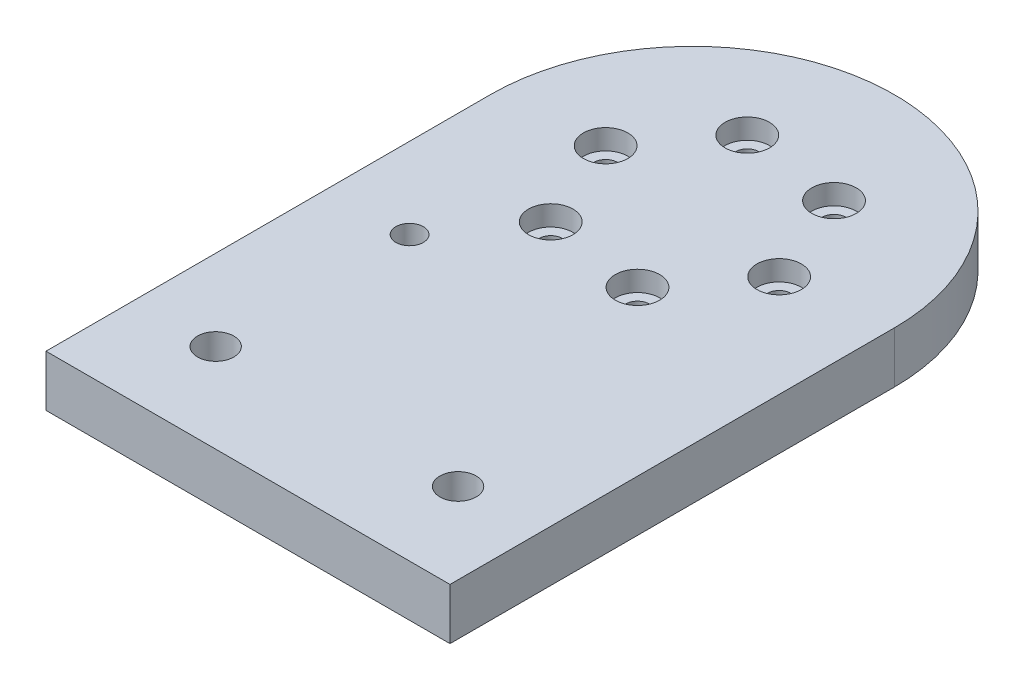
ISO-10303-21;
HEADER;
FILE_DESCRIPTION(('STEP AP214'),'2;1');
FILE_NAME('part.step','',(''),(''),'','','');
FILE_SCHEMA(('AUTOMOTIVE_DESIGN { 1 0 10303 214 1 1 1 1 }'));
ENDSEC;
DATA;
#1=APPLICATION_CONTEXT('core data for automotive mechanical design processes');
#2=APPLICATION_PROTOCOL_DEFINITION('international standard','automotive_design',2000,#1);
#3=PRODUCT_CONTEXT('',#1,'mechanical');
#4=PRODUCT('Part','Part','',(#3));
#5=PRODUCT_RELATED_PRODUCT_CATEGORY('part','',(#4));
#6=PRODUCT_DEFINITION_FORMATION('','',#4);
#7=PRODUCT_DEFINITION_CONTEXT('part definition',#1,'design');
#8=PRODUCT_DEFINITION('design','',#6,#7);
#9=PRODUCT_DEFINITION_SHAPE('','',#8);
#10=(LENGTH_UNIT() NAMED_UNIT(*) SI_UNIT(.MILLI.,.METRE.));
#11=(NAMED_UNIT(*) PLANE_ANGLE_UNIT() SI_UNIT($,.RADIAN.));
#12=(NAMED_UNIT(*) SI_UNIT($,.STERADIAN.) SOLID_ANGLE_UNIT());
#13=UNCERTAINTY_MEASURE_WITH_UNIT(LENGTH_MEASURE(1.E-05),#10,'distance_accuracy_value','');
#14=(GEOMETRIC_REPRESENTATION_CONTEXT(3) GLOBAL_UNCERTAINTY_ASSIGNED_CONTEXT((#13)) GLOBAL_UNIT_ASSIGNED_CONTEXT((#10,
#11,#12)) REPRESENTATION_CONTEXT('',''));
#15=CARTESIAN_POINT('',(0.,0.,0.));
#16=DIRECTION('',(0.,0.,1.));
#17=DIRECTION('',(1.,0.,0.));
#18=AXIS2_PLACEMENT_3D('',#15,#16,#17);
#19=CARTESIAN_POINT('',(4.76337970437843,40.85,501.556825420154));
#20=DIRECTION('',(0.,-1.,0.));
#21=DIRECTION('',(0.,0.,-1.));
#22=AXIS2_PLACEMENT_3D('',#19,#20,#21);
#23=CYLINDRICAL_SURFACE('',#22,1.45);
#24=CARTESIAN_POINT('',(4.76337970437843,34.5,501.556825420154));
#25=DIRECTION('',(0.,1.,0.));
#26=DIRECTION('',(0.,0.,1.));
#27=AXIS2_PLACEMENT_3D('',#24,#25,#26);
#28=CIRCLE('',#27,1.45);
#29=CARTESIAN_POINT('',(4.76337970437843,34.5,503.006825420154));
#30=VERTEX_POINT('',#29);
#31=EDGE_CURVE('E152',#30,#30,#28,.T.);
#32=ORIENTED_EDGE('',*,*,#31,.F.);
#33=EDGE_LOOP('',(#32));
#34=FACE_BOUND('',#33,.T.);
#35=CARTESIAN_POINT('',(4.76337970437843,38.35,501.556825420154));
#36=DIRECTION('',(0.,1.,0.));
#37=DIRECTION('',(0.,0.,1.));
#38=AXIS2_PLACEMENT_3D('',#35,#36,#37);
#39=CIRCLE('',#38,1.45);
#40=CARTESIAN_POINT('',(4.76337970437843,38.35,503.006825420154));
#41=VERTEX_POINT('',#40);
#42=EDGE_CURVE('E43',#41,#41,#39,.T.);
#43=ORIENTED_EDGE('',*,*,#42,.T.);
#44=EDGE_LOOP('',(#43));
#45=FACE_BOUND('',#44,.T.);
#46=ADVANCED_FACE('F39',(#34,#45),#23,.F.);
#47=CARTESIAN_POINT('',(-7.62681454876585,40.85,499.90362054194));
#48=DIRECTION('',(0.,-1.,0.));
#49=DIRECTION('',(0.,0.,-1.));
#50=AXIS2_PLACEMENT_3D('',#47,#48,#49);
#51=CYLINDRICAL_SURFACE('',#50,1.45);
#52=CARTESIAN_POINT('',(-7.62681454876585,34.5,499.90362054194));
#53=DIRECTION('',(0.,1.,0.));
#54=DIRECTION('',(0.,0.,1.));
#55=AXIS2_PLACEMENT_3D('',#52,#53,#54);
#56=CIRCLE('',#55,1.45);
#57=CARTESIAN_POINT('',(-7.62681454876585,34.5,501.35362054194));
#58=VERTEX_POINT('',#57);
#59=EDGE_CURVE('E160',#58,#58,#56,.T.);
#60=ORIENTED_EDGE('',*,*,#59,.F.);
#61=EDGE_LOOP('',(#60));
#62=FACE_BOUND('',#61,.T.);
#63=CARTESIAN_POINT('',(-7.62681454876585,38.35,499.90362054194));
#64=DIRECTION('',(0.,1.,0.));
#65=DIRECTION('',(0.,0.,1.));
#66=AXIS2_PLACEMENT_3D('',#63,#64,#65);
#67=CIRCLE('',#66,1.45);
#68=CARTESIAN_POINT('',(-7.62681454876585,38.35,501.35362054194));
#69=VERTEX_POINT('',#68);
#70=EDGE_CURVE('E183',#69,#69,#67,.T.);
#71=ORIENTED_EDGE('',*,*,#70,.T.);
#72=EDGE_LOOP('',(#71));
#73=FACE_BOUND('',#72,.T.);
#74=ADVANCED_FACE('F211',(#62,#73),#51,.F.);
#75=CARTESIAN_POINT('',(-12.3901942531443,40.85,488.346795121786));
#76=DIRECTION('',(0.,-1.,0.));
#77=DIRECTION('',(0.,0.,-1.));
#78=AXIS2_PLACEMENT_3D('',#75,#76,#77);
#79=CYLINDRICAL_SURFACE('',#78,1.45);
#80=CARTESIAN_POINT('',(-12.3901942531443,34.5,488.346795121786));
#81=DIRECTION('',(0.,1.,0.));
#82=DIRECTION('',(0.,0.,1.));
#83=AXIS2_PLACEMENT_3D('',#80,#81,#82);
#84=CIRCLE('',#83,1.45);
#85=CARTESIAN_POINT('',(-12.3901942531443,34.5,489.796795121786));
#86=VERTEX_POINT('',#85);
#87=EDGE_CURVE('E163',#86,#86,#84,.T.);
#88=ORIENTED_EDGE('',*,*,#87,.F.);
#89=EDGE_LOOP('',(#88));
#90=FACE_BOUND('',#89,.T.);
#91=CARTESIAN_POINT('',(-12.3901942531443,38.35,488.346795121786));
#92=DIRECTION('',(0.,1.,0.));
#93=DIRECTION('',(0.,0.,1.));
#94=AXIS2_PLACEMENT_3D('',#91,#92,#93);
#95=CIRCLE('',#94,1.45);
#96=CARTESIAN_POINT('',(-12.3901942531443,38.35,489.796795121786));
#97=VERTEX_POINT('',#96);
#98=EDGE_CURVE('E185',#97,#97,#95,.T.);
#99=ORIENTED_EDGE('',*,*,#98,.T.);
#100=EDGE_LOOP('',(#99));
#101=FACE_BOUND('',#100,.T.);
#102=ADVANCED_FACE('F220',(#90,#101),#79,.F.);
#103=CARTESIAN_POINT('',(-4.76337970437842,40.85,478.443174579846));
#104=DIRECTION('',(0.,-1.,0.));
#105=DIRECTION('',(0.,0.,-1.));
#106=AXIS2_PLACEMENT_3D('',#103,#104,#105);
#107=CYLINDRICAL_SURFACE('',#106,1.45);
#108=CARTESIAN_POINT('',(-4.76337970437842,34.5,478.443174579846));
#109=DIRECTION('',(0.,1.,0.));
#110=DIRECTION('',(0.,0.,1.));
#111=AXIS2_PLACEMENT_3D('',#108,#109,#110);
#112=CIRCLE('',#111,1.45);
#113=CARTESIAN_POINT('',(-4.76337970437842,34.5,479.893174579846));
#114=VERTEX_POINT('',#113);
#115=EDGE_CURVE('E153',#114,#114,#112,.T.);
#116=ORIENTED_EDGE('',*,*,#115,.F.);
#117=EDGE_LOOP('',(#116));
#118=FACE_BOUND('',#117,.T.);
#119=CARTESIAN_POINT('',(-4.76337970437842,38.35,478.443174579846));
#120=DIRECTION('',(0.,1.,0.));
#121=DIRECTION('',(0.,0.,1.));
#122=AXIS2_PLACEMENT_3D('',#119,#120,#121);
#123=CIRCLE('',#122,1.45);
#124=CARTESIAN_POINT('',(-4.76337970437842,38.35,479.893174579846));
#125=VERTEX_POINT('',#124);
#126=EDGE_CURVE('E177',#125,#125,#123,.T.);
#127=ORIENTED_EDGE('',*,*,#126,.T.);
#128=EDGE_LOOP('',(#127));
#129=FACE_BOUND('',#128,.T.);
#130=ADVANCED_FACE('F226',(#118,#129),#107,.F.);
#131=CARTESIAN_POINT('',(7.62681454876585,40.85,480.09637945806));
#132=DIRECTION('',(0.,-1.,0.));
#133=DIRECTION('',(0.,0.,-1.));
#134=AXIS2_PLACEMENT_3D('',#131,#132,#133);
#135=CYLINDRICAL_SURFACE('',#134,1.45);
#136=CARTESIAN_POINT('',(7.62681454876585,34.5,480.09637945806));
#137=DIRECTION('',(0.,1.,0.));
#138=DIRECTION('',(0.,0.,1.));
#139=AXIS2_PLACEMENT_3D('',#136,#137,#138);
#140=CIRCLE('',#139,1.45);
#141=CARTESIAN_POINT('',(7.62681454876585,34.5,481.54637945806));
#142=VERTEX_POINT('',#141);
#143=EDGE_CURVE('E154',#142,#142,#140,.T.);
#144=ORIENTED_EDGE('',*,*,#143,.F.);
#145=EDGE_LOOP('',(#144));
#146=FACE_BOUND('',#145,.T.);
#147=CARTESIAN_POINT('',(7.62681454876585,38.35,480.09637945806));
#148=DIRECTION('',(0.,1.,0.));
#149=DIRECTION('',(0.,0.,1.));
#150=AXIS2_PLACEMENT_3D('',#147,#148,#149);
#151=CIRCLE('',#150,1.45);
#152=CARTESIAN_POINT('',(7.62681454876585,38.35,481.54637945806));
#153=VERTEX_POINT('',#152);
#154=EDGE_CURVE('E176',#153,#153,#151,.T.);
#155=ORIENTED_EDGE('',*,*,#154,.T.);
#156=EDGE_LOOP('',(#155));
#157=FACE_BOUND('',#156,.T.);
#158=ADVANCED_FACE('F225',(#146,#157),#135,.F.);
#159=CARTESIAN_POINT('',(12.3901942531443,40.85,491.653204878214));
#160=DIRECTION('',(0.,-1.,0.));
#161=DIRECTION('',(0.,0.,-1.));
#162=AXIS2_PLACEMENT_3D('',#159,#160,#161);
#163=CYLINDRICAL_SURFACE('',#162,1.45);
#164=CARTESIAN_POINT('',(12.3901942531443,34.5,491.653204878214));
#165=DIRECTION('',(0.,1.,0.));
#166=DIRECTION('',(0.,0.,1.));
#167=AXIS2_PLACEMENT_3D('',#164,#165,#166);
#168=CIRCLE('',#167,1.45);
#169=CARTESIAN_POINT('',(12.3901942531443,34.5,493.103204878214));
#170=VERTEX_POINT('',#169);
#171=EDGE_CURVE('E149',#170,#170,#168,.T.);
#172=ORIENTED_EDGE('',*,*,#171,.F.);
#173=EDGE_LOOP('',(#172));
#174=FACE_BOUND('',#173,.T.);
#175=CARTESIAN_POINT('',(12.3901942531443,38.35,491.653204878214));
#176=DIRECTION('',(0.,1.,0.));
#177=DIRECTION('',(0.,0.,1.));
#178=AXIS2_PLACEMENT_3D('',#175,#176,#177);
#179=CIRCLE('',#178,1.45);
#180=CARTESIAN_POINT('',(12.3901942531443,38.35,493.103204878214));
#181=VERTEX_POINT('',#180);
#182=EDGE_CURVE('E143',#181,#181,#179,.T.);
#183=ORIENTED_EDGE('',*,*,#182,.T.);
#184=EDGE_LOOP('',(#183));
#185=FACE_BOUND('',#184,.T.);
#186=ADVANCED_FACE('F250',(#174,#185),#163,.F.);
#187=CARTESIAN_POINT('',(25.,40.85,526.));
#188=DIRECTION('',(-1.,0.,0.));
#189=DIRECTION('',(0.,0.,1.));
#190=AXIS2_PLACEMENT_3D('',#187,#188,#189);
#191=PLANE('',#190);
#192=DIRECTION('',(0.,0.,-1.));
#193=VECTOR('',#192,1.);
#194=CARTESIAN_POINT('',(25.,34.5,526.));
#195=LINE('',#194,#193);
#196=CARTESIAN_POINT('',(25.,34.5,545.));
#197=VERTEX_POINT('',#196);
#198=CARTESIAN_POINT('',(25.,34.5,490.));
#199=VERTEX_POINT('',#198);
#200=EDGE_CURVE('E170',#197,#199,#195,.T.);
#201=ORIENTED_EDGE('',*,*,#200,.T.);
#202=DIRECTION('',(0.,-1.,0.));
#203=VECTOR('',#202,1.);
#204=CARTESIAN_POINT('',(25.,40.85,490.));
#205=LINE('',#204,#203);
#206=CARTESIAN_POINT('',(25.,40.85,490.));
#207=VERTEX_POINT('',#206);
#208=EDGE_CURVE('E11',#207,#199,#205,.T.);
#209=ORIENTED_EDGE('',*,*,#208,.F.);
#210=DIRECTION('',(0.,0.,-1.));
#211=VECTOR('',#210,1.);
#212=CARTESIAN_POINT('',(25.,40.85,526.));
#213=LINE('',#212,#211);
#214=CARTESIAN_POINT('',(25.,40.85,545.));
#215=VERTEX_POINT('',#214);
#216=EDGE_CURVE('E90',#215,#207,#213,.T.);
#217=ORIENTED_EDGE('',*,*,#216,.F.);
#218=DIRECTION('',(0.,-1.,0.));
#219=VECTOR('',#218,1.);
#220=CARTESIAN_POINT('',(25.,40.85,545.));
#221=LINE('',#220,#219);
#222=EDGE_CURVE('E100',#215,#197,#221,.T.);
#223=ORIENTED_EDGE('',*,*,#222,.T.);
#224=EDGE_LOOP('',(#201,#209,#217,#223));
#225=FACE_BOUND('',#224,.T.);
#226=ADVANCED_FACE('F41',(#225),#191,.F.);
#227=CARTESIAN_POINT('',(-25.,40.85,526.));
#228=DIRECTION('',(1.,0.,0.));
#229=DIRECTION('',(0.,0.,-1.));
#230=AXIS2_PLACEMENT_3D('',#227,#228,#229);
#231=PLANE('',#230);
#232=DIRECTION('',(0.,0.,1.));
#233=VECTOR('',#232,1.);
#234=CARTESIAN_POINT('',(-25.,34.5,526.));
#235=LINE('',#234,#233);
#236=CARTESIAN_POINT('',(-25.,34.5,490.));
#237=VERTEX_POINT('',#236);
#238=CARTESIAN_POINT('',(-25.,34.5,545.));
#239=VERTEX_POINT('',#238);
#240=EDGE_CURVE('E93',#237,#239,#235,.T.);
#241=ORIENTED_EDGE('',*,*,#240,.T.);
#242=DIRECTION('',(0.,-1.,0.));
#243=VECTOR('',#242,1.);
#244=CARTESIAN_POINT('',(-25.,40.85,545.));
#245=LINE('',#244,#243);
#246=CARTESIAN_POINT('',(-25.,40.85,545.));
#247=VERTEX_POINT('',#246);
#248=EDGE_CURVE('E94',#247,#239,#245,.T.);
#249=ORIENTED_EDGE('',*,*,#248,.F.);
#250=DIRECTION('',(0.,0.,1.));
#251=VECTOR('',#250,1.);
#252=CARTESIAN_POINT('',(-25.,40.85,526.));
#253=LINE('',#252,#251);
#254=CARTESIAN_POINT('',(-25.,40.85,490.));
#255=VERTEX_POINT('',#254);
#256=EDGE_CURVE('E79',#255,#247,#253,.T.);
#257=ORIENTED_EDGE('',*,*,#256,.F.);
#258=DIRECTION('',(0.,-1.,0.));
#259=VECTOR('',#258,1.);
#260=CARTESIAN_POINT('',(-25.,40.85,490.));
#261=LINE('',#260,#259);
#262=EDGE_CURVE('E48',#255,#237,#261,.T.);
#263=ORIENTED_EDGE('',*,*,#262,.T.);
#264=EDGE_LOOP('',(#241,#249,#257,#263));
#265=FACE_BOUND('',#264,.T.);
#266=ADVANCED_FACE('F91',(#265),#231,.F.);
#267=CARTESIAN_POINT('',(0.,40.85,0.));
#268=DIRECTION('',(0.,-1.,0.));
#269=DIRECTION('',(0.,0.,-1.));
#270=AXIS2_PLACEMENT_3D('',#267,#268,#269);
#271=PLANE('',#270);
#272=CARTESIAN_POINT('',(-15.,40.85,510.));
#273=DIRECTION('',(0.,1.,0.));
#274=DIRECTION('',(0.,0.,1.));
#275=AXIS2_PLACEMENT_3D('',#272,#273,#274);
#276=CIRCLE('',#275,1.7);
#277=CARTESIAN_POINT('',(-15.,40.85,511.7));
#278=VERTEX_POINT('',#277);
#279=EDGE_CURVE('E332',#278,#278,#276,.T.);
#280=ORIENTED_EDGE('',*,*,#279,.F.);
#281=EDGE_LOOP('',(#280));
#282=FACE_BOUND('',#281,.T.);
#283=CARTESIAN_POINT('',(-15.,40.85,534.));
#284=DIRECTION('',(0.,1.,0.));
#285=DIRECTION('',(0.,0.,1.));
#286=AXIS2_PLACEMENT_3D('',#283,#284,#285);
#287=CIRCLE('',#286,2.25);
#288=CARTESIAN_POINT('',(-15.,40.85,536.25));
#289=VERTEX_POINT('',#288);
#290=EDGE_CURVE('E106',#289,#289,#287,.T.);
#291=ORIENTED_EDGE('',*,*,#290,.F.);
#292=EDGE_LOOP('',(#291));
#293=FACE_BOUND('',#292,.T.);
#294=CARTESIAN_POINT('',(15.,40.85,534.));
#295=DIRECTION('',(0.,1.,0.));
#296=DIRECTION('',(0.,0.,1.));
#297=AXIS2_PLACEMENT_3D('',#294,#295,#296);
#298=CIRCLE('',#297,2.25);
#299=CARTESIAN_POINT('',(15.,40.85,536.25));
#300=VERTEX_POINT('',#299);
#301=EDGE_CURVE('E107',#300,#300,#298,.T.);
#302=ORIENTED_EDGE('',*,*,#301,.F.);
#303=EDGE_LOOP('',(#302));
#304=FACE_BOUND('',#303,.T.);
#305=CARTESIAN_POINT('',(4.76337970437843,40.85,501.556825420154));
#306=DIRECTION('',(0.,1.,0.));
#307=DIRECTION('',(0.,0.,1.));
#308=AXIS2_PLACEMENT_3D('',#305,#306,#307);
#309=CIRCLE('',#308,2.75);
#310=CARTESIAN_POINT('',(4.76337970437843,40.85,504.306825420154));
#311=VERTEX_POINT('',#310);
#312=EDGE_CURVE('E125',#311,#311,#309,.T.);
#313=ORIENTED_EDGE('',*,*,#312,.F.);
#314=EDGE_LOOP('',(#313));
#315=FACE_BOUND('',#314,.T.);
#316=CARTESIAN_POINT('',(-7.62681454876585,40.85,499.90362054194));
#317=DIRECTION('',(0.,1.,0.));
#318=DIRECTION('',(0.,0.,1.));
#319=AXIS2_PLACEMENT_3D('',#316,#317,#318);
#320=CIRCLE('',#319,2.75);
#321=CARTESIAN_POINT('',(-7.62681454876585,40.85,502.65362054194));
#322=VERTEX_POINT('',#321);
#323=EDGE_CURVE('E129',#322,#322,#320,.T.);
#324=ORIENTED_EDGE('',*,*,#323,.F.);
#325=EDGE_LOOP('',(#324));
#326=FACE_BOUND('',#325,.T.);
#327=CARTESIAN_POINT('',(-12.3901942531443,40.85,488.346795121786));
#328=DIRECTION('',(0.,1.,0.));
#329=DIRECTION('',(0.,0.,1.));
#330=AXIS2_PLACEMENT_3D('',#327,#328,#329);
#331=CIRCLE('',#330,2.75);
#332=CARTESIAN_POINT('',(-12.3901942531443,40.85,491.096795121786));
#333=VERTEX_POINT('',#332);
#334=EDGE_CURVE('E131',#333,#333,#331,.T.);
#335=ORIENTED_EDGE('',*,*,#334,.F.);
#336=EDGE_LOOP('',(#335));
#337=FACE_BOUND('',#336,.T.);
#338=CARTESIAN_POINT('',(-4.76337970437842,40.85,478.443174579846));
#339=DIRECTION('',(0.,1.,0.));
#340=DIRECTION('',(0.,0.,1.));
#341=AXIS2_PLACEMENT_3D('',#338,#339,#340);
#342=CIRCLE('',#341,2.75);
#343=CARTESIAN_POINT('',(-4.76337970437842,40.85,481.193174579846));
#344=VERTEX_POINT('',#343);
#345=EDGE_CURVE('E114',#344,#344,#342,.T.);
#346=ORIENTED_EDGE('',*,*,#345,.F.);
#347=EDGE_LOOP('',(#346));
#348=FACE_BOUND('',#347,.T.);
#349=CARTESIAN_POINT('',(7.62681454876585,40.85,480.09637945806));
#350=DIRECTION('',(0.,1.,0.));
#351=DIRECTION('',(0.,0.,1.));
#352=AXIS2_PLACEMENT_3D('',#349,#350,#351);
#353=CIRCLE('',#352,2.75);
#354=CARTESIAN_POINT('',(7.62681454876585,40.85,482.84637945806));
#355=VERTEX_POINT('',#354);
#356=EDGE_CURVE('E96',#355,#355,#353,.T.);
#357=ORIENTED_EDGE('',*,*,#356,.F.);
#358=EDGE_LOOP('',(#357));
#359=FACE_BOUND('',#358,.T.);
#360=CARTESIAN_POINT('',(12.3901942531443,40.85,491.653204878214));
#361=DIRECTION('',(0.,1.,0.));
#362=DIRECTION('',(0.,0.,1.));
#363=AXIS2_PLACEMENT_3D('',#360,#361,#362);
#364=CIRCLE('',#363,2.75);
#365=CARTESIAN_POINT('',(12.3901942531443,40.85,494.403204878214));
#366=VERTEX_POINT('',#365);
#367=EDGE_CURVE('E145',#366,#366,#364,.T.);
#368=ORIENTED_EDGE('',*,*,#367,.F.);
#369=EDGE_LOOP('',(#368));
#370=FACE_BOUND('',#369,.T.);
#371=ORIENTED_EDGE('',*,*,#216,.T.);
#372=CARTESIAN_POINT('',(0.,40.85,490.));
#373=DIRECTION('',(0.,1.,0.));
#374=DIRECTION('',(0.,0.,1.));
#375=AXIS2_PLACEMENT_3D('',#372,#373,#374);
#376=CIRCLE('',#375,25.);
#377=EDGE_CURVE('E87',#207,#255,#376,.T.);
#378=ORIENTED_EDGE('',*,*,#377,.T.);
#379=ORIENTED_EDGE('',*,*,#256,.T.);
#380=DIRECTION('',(1.,0.,0.));
#381=VECTOR('',#380,1.);
#382=CARTESIAN_POINT('',(-25.,40.85,545.));
#383=LINE('',#382,#381);
#384=EDGE_CURVE('E83',#247,#215,#383,.T.);
#385=ORIENTED_EDGE('',*,*,#384,.T.);
#386=EDGE_LOOP('',(#371,#378,#379,#385));
#387=FACE_BOUND('',#386,.T.);
#388=ADVANCED_FACE('F82',(#282,#293,#304,#315,#326,#337,#348,#359,#370,#387),#271,.F.);
#389=CARTESIAN_POINT('',(0.,34.5,0.));
#390=DIRECTION('',(0.,-1.,0.));
#391=DIRECTION('',(0.,0.,-1.));
#392=AXIS2_PLACEMENT_3D('',#389,#390,#391);
#393=PLANE('',#392);
#394=CARTESIAN_POINT('',(-15.,34.5,510.));
#395=DIRECTION('',(0.,1.,0.));
#396=DIRECTION('',(0.,0.,1.));
#397=AXIS2_PLACEMENT_3D('',#394,#395,#396);
#398=CIRCLE('',#397,1.7);
#399=CARTESIAN_POINT('',(-15.,34.5,511.7));
#400=VERTEX_POINT('',#399);
#401=EDGE_CURVE('E336',#400,#400,#398,.T.);
#402=ORIENTED_EDGE('',*,*,#401,.T.);
#403=EDGE_LOOP('',(#402));
#404=FACE_BOUND('',#403,.T.);
#405=CARTESIAN_POINT('',(-15.,34.5,534.));
#406=DIRECTION('',(0.,1.,0.));
#407=DIRECTION('',(0.,0.,1.));
#408=AXIS2_PLACEMENT_3D('',#405,#406,#407);
#409=CIRCLE('',#408,2.25);
#410=CARTESIAN_POINT('',(-15.,34.5,536.25));
#411=VERTEX_POINT('',#410);
#412=EDGE_CURVE('E343',#411,#411,#409,.T.);
#413=ORIENTED_EDGE('',*,*,#412,.T.);
#414=EDGE_LOOP('',(#413));
#415=FACE_BOUND('',#414,.T.);
#416=CARTESIAN_POINT('',(15.,34.5,534.));
#417=DIRECTION('',(0.,1.,0.));
#418=DIRECTION('',(0.,0.,1.));
#419=AXIS2_PLACEMENT_3D('',#416,#417,#418);
#420=CIRCLE('',#419,2.25);
#421=CARTESIAN_POINT('',(15.,34.5,536.25));
#422=VERTEX_POINT('',#421);
#423=EDGE_CURVE('E347',#422,#422,#420,.T.);
#424=ORIENTED_EDGE('',*,*,#423,.T.);
#425=EDGE_LOOP('',(#424));
#426=FACE_BOUND('',#425,.T.);
#427=ORIENTED_EDGE('',*,*,#171,.T.);
#428=EDGE_LOOP('',(#427));
#429=FACE_BOUND('',#428,.T.);
#430=ORIENTED_EDGE('',*,*,#143,.T.);
#431=EDGE_LOOP('',(#430));
#432=FACE_BOUND('',#431,.T.);
#433=ORIENTED_EDGE('',*,*,#115,.T.);
#434=EDGE_LOOP('',(#433));
#435=FACE_BOUND('',#434,.T.);
#436=ORIENTED_EDGE('',*,*,#87,.T.);
#437=EDGE_LOOP('',(#436));
#438=FACE_BOUND('',#437,.T.);
#439=ORIENTED_EDGE('',*,*,#59,.T.);
#440=EDGE_LOOP('',(#439));
#441=FACE_BOUND('',#440,.T.);
#442=ORIENTED_EDGE('',*,*,#31,.T.);
#443=EDGE_LOOP('',(#442));
#444=FACE_BOUND('',#443,.T.);
#445=ORIENTED_EDGE('',*,*,#240,.F.);
#446=CARTESIAN_POINT('',(0.,34.5,490.));
#447=DIRECTION('',(0.,1.,0.));
#448=DIRECTION('',(0.,0.,1.));
#449=AXIS2_PLACEMENT_3D('',#446,#447,#448);
#450=CIRCLE('',#449,25.);
#451=EDGE_CURVE('E54',#199,#237,#450,.T.);
#452=ORIENTED_EDGE('',*,*,#451,.F.);
#453=ORIENTED_EDGE('',*,*,#200,.F.);
#454=DIRECTION('',(1.,0.,0.));
#455=VECTOR('',#454,1.);
#456=CARTESIAN_POINT('',(-25.,34.5,545.));
#457=LINE('',#456,#455);
#458=EDGE_CURVE('E101',#239,#197,#457,.T.);
#459=ORIENTED_EDGE('',*,*,#458,.F.);
#460=EDGE_LOOP('',(#445,#452,#453,#459));
#461=FACE_BOUND('',#460,.T.);
#462=ADVANCED_FACE('F236',(#404,#415,#426,#429,#432,#435,#438,#441,#444,#461),#393,.T.);
#463=CARTESIAN_POINT('',(0.,40.85,490.));
#464=DIRECTION('',(0.,-1.,0.));
#465=DIRECTION('',(0.,0.,-1.));
#466=AXIS2_PLACEMENT_3D('',#463,#464,#465);
#467=CYLINDRICAL_SURFACE('',#466,25.);
#468=ORIENTED_EDGE('',*,*,#377,.F.);
#469=ORIENTED_EDGE('',*,*,#208,.T.);
#470=ORIENTED_EDGE('',*,*,#451,.T.);
#471=ORIENTED_EDGE('',*,*,#262,.F.);
#472=EDGE_LOOP('',(#468,#469,#470,#471));
#473=FACE_BOUND('',#472,.T.);
#474=ADVANCED_FACE('F231',(#473),#467,.T.);
#475=CARTESIAN_POINT('',(12.3901942531443,40.85,491.653204878214));
#476=DIRECTION('',(0.,-1.,0.));
#477=DIRECTION('',(0.,0.,-1.));
#478=AXIS2_PLACEMENT_3D('',#475,#476,#477);
#479=CYLINDRICAL_SURFACE('',#478,2.75);
#480=ORIENTED_EDGE('',*,*,#367,.T.);
#481=EDGE_LOOP('',(#480));
#482=FACE_BOUND('',#481,.T.);
#483=CARTESIAN_POINT('',(12.3901942531443,38.35,491.653204878214));
#484=DIRECTION('',(0.,1.,0.));
#485=DIRECTION('',(0.,0.,1.));
#486=AXIS2_PLACEMENT_3D('',#483,#484,#485);
#487=CIRCLE('',#486,2.75);
#488=CARTESIAN_POINT('',(12.3901942531443,38.35,494.403204878214));
#489=VERTEX_POINT('',#488);
#490=EDGE_CURVE('E122',#489,#489,#487,.T.);
#491=ORIENTED_EDGE('',*,*,#490,.F.);
#492=EDGE_LOOP('',(#491));
#493=FACE_BOUND('',#492,.T.);
#494=ADVANCED_FACE('F232',(#482,#493),#479,.F.);
#495=CARTESIAN_POINT('',(12.3901942531443,38.35,491.653204878214));
#496=DIRECTION('',(0.,1.,0.));
#497=DIRECTION('',(0.,0.,1.));
#498=AXIS2_PLACEMENT_3D('',#495,#496,#497);
#499=PLANE('',#498);
#500=ORIENTED_EDGE('',*,*,#182,.F.);
#501=EDGE_LOOP('',(#500));
#502=FACE_BOUND('',#501,.T.);
#503=ORIENTED_EDGE('',*,*,#490,.T.);
#504=EDGE_LOOP('',(#503));
#505=FACE_BOUND('',#504,.T.);
#506=ADVANCED_FACE('F265',(#502,#505),#499,.T.);
#507=CARTESIAN_POINT('',(7.62681454876585,40.85,480.09637945806));
#508=DIRECTION('',(0.,-1.,0.));
#509=DIRECTION('',(0.,0.,-1.));
#510=AXIS2_PLACEMENT_3D('',#507,#508,#509);
#511=CYLINDRICAL_SURFACE('',#510,2.75);
#512=ORIENTED_EDGE('',*,*,#356,.T.);
#513=EDGE_LOOP('',(#512));
#514=FACE_BOUND('',#513,.T.);
#515=CARTESIAN_POINT('',(7.62681454876585,38.35,480.09637945806));
#516=DIRECTION('',(0.,1.,0.));
#517=DIRECTION('',(0.,0.,1.));
#518=AXIS2_PLACEMENT_3D('',#515,#516,#517);
#519=CIRCLE('',#518,2.75);
#520=CARTESIAN_POINT('',(7.62681454876585,38.35,482.84637945806));
#521=VERTEX_POINT('',#520);
#522=EDGE_CURVE('E115',#521,#521,#519,.T.);
#523=ORIENTED_EDGE('',*,*,#522,.F.);
#524=EDGE_LOOP('',(#523));
#525=FACE_BOUND('',#524,.T.);
#526=ADVANCED_FACE('F266',(#514,#525),#511,.F.);
#527=CARTESIAN_POINT('',(7.62681454876585,38.35,480.09637945806));
#528=DIRECTION('',(0.,1.,0.));
#529=DIRECTION('',(0.,0.,1.));
#530=AXIS2_PLACEMENT_3D('',#527,#528,#529);
#531=PLANE('',#530);
#532=ORIENTED_EDGE('',*,*,#154,.F.);
#533=EDGE_LOOP('',(#532));
#534=FACE_BOUND('',#533,.T.);
#535=ORIENTED_EDGE('',*,*,#522,.T.);
#536=EDGE_LOOP('',(#535));
#537=FACE_BOUND('',#536,.T.);
#538=ADVANCED_FACE('F277',(#534,#537),#531,.T.);
#539=CARTESIAN_POINT('',(-4.76337970437842,40.85,478.443174579846));
#540=DIRECTION('',(0.,-1.,0.));
#541=DIRECTION('',(0.,0.,-1.));
#542=AXIS2_PLACEMENT_3D('',#539,#540,#541);
#543=CYLINDRICAL_SURFACE('',#542,2.75);
#544=ORIENTED_EDGE('',*,*,#345,.T.);
#545=EDGE_LOOP('',(#544));
#546=FACE_BOUND('',#545,.T.);
#547=CARTESIAN_POINT('',(-4.76337970437842,38.35,478.443174579846));
#548=DIRECTION('',(0.,1.,0.));
#549=DIRECTION('',(0.,0.,1.));
#550=AXIS2_PLACEMENT_3D('',#547,#548,#549);
#551=CIRCLE('',#550,2.75);
#552=CARTESIAN_POINT('',(-4.76337970437842,38.35,481.193174579846));
#553=VERTEX_POINT('',#552);
#554=EDGE_CURVE('E136',#553,#553,#551,.T.);
#555=ORIENTED_EDGE('',*,*,#554,.F.);
#556=EDGE_LOOP('',(#555));
#557=FACE_BOUND('',#556,.T.);
#558=ADVANCED_FACE('F271',(#546,#557),#543,.F.);
#559=CARTESIAN_POINT('',(-4.76337970437842,38.35,478.443174579846));
#560=DIRECTION('',(0.,1.,0.));
#561=DIRECTION('',(0.,0.,1.));
#562=AXIS2_PLACEMENT_3D('',#559,#560,#561);
#563=PLANE('',#562);
#564=ORIENTED_EDGE('',*,*,#126,.F.);
#565=EDGE_LOOP('',(#564));
#566=FACE_BOUND('',#565,.T.);
#567=ORIENTED_EDGE('',*,*,#554,.T.);
#568=EDGE_LOOP('',(#567));
#569=FACE_BOUND('',#568,.T.);
#570=ADVANCED_FACE('F268',(#566,#569),#563,.T.);
#571=CARTESIAN_POINT('',(-12.3901942531443,40.85,488.346795121786));
#572=DIRECTION('',(0.,-1.,0.));
#573=DIRECTION('',(0.,0.,-1.));
#574=AXIS2_PLACEMENT_3D('',#571,#572,#573);
#575=CYLINDRICAL_SURFACE('',#574,2.75);
#576=ORIENTED_EDGE('',*,*,#334,.T.);
#577=EDGE_LOOP('',(#576));
#578=FACE_BOUND('',#577,.T.);
#579=CARTESIAN_POINT('',(-12.3901942531443,38.35,488.346795121786));
#580=DIRECTION('',(0.,1.,0.));
#581=DIRECTION('',(0.,0.,1.));
#582=AXIS2_PLACEMENT_3D('',#579,#580,#581);
#583=CIRCLE('',#582,2.75);
#584=CARTESIAN_POINT('',(-12.3901942531443,38.35,491.096795121786));
#585=VERTEX_POINT('',#584);
#586=EDGE_CURVE('E132',#585,#585,#583,.T.);
#587=ORIENTED_EDGE('',*,*,#586,.F.);
#588=EDGE_LOOP('',(#587));
#589=FACE_BOUND('',#588,.T.);
#590=ADVANCED_FACE('F275',(#578,#589),#575,.F.);
#591=CARTESIAN_POINT('',(-12.3901942531443,38.35,488.346795121786));
#592=DIRECTION('',(0.,1.,0.));
#593=DIRECTION('',(0.,0.,1.));
#594=AXIS2_PLACEMENT_3D('',#591,#592,#593);
#595=PLANE('',#594);
#596=ORIENTED_EDGE('',*,*,#98,.F.);
#597=EDGE_LOOP('',(#596));
#598=FACE_BOUND('',#597,.T.);
#599=ORIENTED_EDGE('',*,*,#586,.T.);
#600=EDGE_LOOP('',(#599));
#601=FACE_BOUND('',#600,.T.);
#602=ADVANCED_FACE('F278',(#598,#601),#595,.T.);
#603=CARTESIAN_POINT('',(-7.62681454876585,40.85,499.90362054194));
#604=DIRECTION('',(0.,-1.,0.));
#605=DIRECTION('',(0.,0.,-1.));
#606=AXIS2_PLACEMENT_3D('',#603,#604,#605);
#607=CYLINDRICAL_SURFACE('',#606,2.75);
#608=ORIENTED_EDGE('',*,*,#323,.T.);
#609=EDGE_LOOP('',(#608));
#610=FACE_BOUND('',#609,.T.);
#611=CARTESIAN_POINT('',(-7.62681454876585,38.35,499.90362054194));
#612=DIRECTION('',(0.,1.,0.));
#613=DIRECTION('',(0.,0.,1.));
#614=AXIS2_PLACEMENT_3D('',#611,#612,#613);
#615=CIRCLE('',#614,2.75);
#616=CARTESIAN_POINT('',(-7.62681454876585,38.35,502.65362054194));
#617=VERTEX_POINT('',#616);
#618=EDGE_CURVE('E123',#617,#617,#615,.T.);
#619=ORIENTED_EDGE('',*,*,#618,.F.);
#620=EDGE_LOOP('',(#619));
#621=FACE_BOUND('',#620,.T.);
#622=ADVANCED_FACE('F207',(#610,#621),#607,.F.);
#623=CARTESIAN_POINT('',(-7.62681454876585,38.35,499.90362054194));
#624=DIRECTION('',(0.,1.,0.));
#625=DIRECTION('',(0.,0.,1.));
#626=AXIS2_PLACEMENT_3D('',#623,#624,#625);
#627=PLANE('',#626);
#628=ORIENTED_EDGE('',*,*,#70,.F.);
#629=EDGE_LOOP('',(#628));
#630=FACE_BOUND('',#629,.T.);
#631=ORIENTED_EDGE('',*,*,#618,.T.);
#632=EDGE_LOOP('',(#631));
#633=FACE_BOUND('',#632,.T.);
#634=ADVANCED_FACE('F198',(#630,#633),#627,.T.);
#635=CARTESIAN_POINT('',(4.76337970437843,40.85,501.556825420154));
#636=DIRECTION('',(0.,-1.,0.));
#637=DIRECTION('',(0.,0.,-1.));
#638=AXIS2_PLACEMENT_3D('',#635,#636,#637);
#639=CYLINDRICAL_SURFACE('',#638,2.75);
#640=ORIENTED_EDGE('',*,*,#312,.T.);
#641=EDGE_LOOP('',(#640));
#642=FACE_BOUND('',#641,.T.);
#643=CARTESIAN_POINT('',(4.76337970437843,38.35,501.556825420154));
#644=DIRECTION('',(0.,1.,0.));
#645=DIRECTION('',(0.,0.,1.));
#646=AXIS2_PLACEMENT_3D('',#643,#644,#645);
#647=CIRCLE('',#646,2.75);
#648=CARTESIAN_POINT('',(4.76337970437843,38.35,504.306825420154));
#649=VERTEX_POINT('',#648);
#650=EDGE_CURVE('E117',#649,#649,#647,.T.);
#651=ORIENTED_EDGE('',*,*,#650,.F.);
#652=EDGE_LOOP('',(#651));
#653=FACE_BOUND('',#652,.T.);
#654=ADVANCED_FACE('F195',(#642,#653),#639,.F.);
#655=CARTESIAN_POINT('',(4.76337970437843,38.35,501.556825420154));
#656=DIRECTION('',(0.,1.,0.));
#657=DIRECTION('',(0.,0.,1.));
#658=AXIS2_PLACEMENT_3D('',#655,#656,#657);
#659=PLANE('',#658);
#660=ORIENTED_EDGE('',*,*,#42,.F.);
#661=EDGE_LOOP('',(#660));
#662=FACE_BOUND('',#661,.T.);
#663=ORIENTED_EDGE('',*,*,#650,.T.);
#664=EDGE_LOOP('',(#663));
#665=FACE_BOUND('',#664,.T.);
#666=ADVANCED_FACE('F192',(#662,#665),#659,.T.);
#667=CARTESIAN_POINT('',(-25.,40.85,545.));
#668=DIRECTION('',(0.,0.,-1.));
#669=DIRECTION('',(-1.,0.,0.));
#670=AXIS2_PLACEMENT_3D('',#667,#668,#669);
#671=PLANE('',#670);
#672=ORIENTED_EDGE('',*,*,#458,.T.);
#673=ORIENTED_EDGE('',*,*,#222,.F.);
#674=ORIENTED_EDGE('',*,*,#384,.F.);
#675=ORIENTED_EDGE('',*,*,#248,.T.);
#676=EDGE_LOOP('',(#672,#673,#674,#675));
#677=FACE_BOUND('',#676,.T.);
#678=ADVANCED_FACE('F103',(#677),#671,.F.);
#679=CARTESIAN_POINT('',(15.,40.85,534.));
#680=DIRECTION('',(0.,-1.,0.));
#681=DIRECTION('',(0.,0.,-1.));
#682=AXIS2_PLACEMENT_3D('',#679,#680,#681);
#683=CYLINDRICAL_SURFACE('',#682,2.25);
#684=ORIENTED_EDGE('',*,*,#301,.T.);
#685=EDGE_LOOP('',(#684));
#686=FACE_BOUND('',#685,.T.);
#687=ORIENTED_EDGE('',*,*,#423,.F.);
#688=EDGE_LOOP('',(#687));
#689=FACE_BOUND('',#688,.T.);
#690=ADVANCED_FACE('F316',(#686,#689),#683,.F.);
#691=CARTESIAN_POINT('',(-15.,40.85,534.));
#692=DIRECTION('',(0.,-1.,0.));
#693=DIRECTION('',(0.,0.,-1.));
#694=AXIS2_PLACEMENT_3D('',#691,#692,#693);
#695=CYLINDRICAL_SURFACE('',#694,2.25);
#696=ORIENTED_EDGE('',*,*,#290,.T.);
#697=EDGE_LOOP('',(#696));
#698=FACE_BOUND('',#697,.T.);
#699=ORIENTED_EDGE('',*,*,#412,.F.);
#700=EDGE_LOOP('',(#699));
#701=FACE_BOUND('',#700,.T.);
#702=ADVANCED_FACE('F322',(#698,#701),#695,.F.);
#703=CARTESIAN_POINT('',(-15.,40.85,510.));
#704=DIRECTION('',(0.,-1.,0.));
#705=DIRECTION('',(0.,0.,-1.));
#706=AXIS2_PLACEMENT_3D('',#703,#704,#705);
#707=CYLINDRICAL_SURFACE('',#706,1.7);
#708=ORIENTED_EDGE('',*,*,#279,.T.);
#709=EDGE_LOOP('',(#708));
#710=FACE_BOUND('',#709,.T.);
#711=ORIENTED_EDGE('',*,*,#401,.F.);
#712=EDGE_LOOP('',(#711));
#713=FACE_BOUND('',#712,.T.);
#714=ADVANCED_FACE('F327',(#710,#713),#707,.F.);
#715=CLOSED_SHELL('',(#46,#74,#102,#130,#158,#186,#226,#266,#388,#462,#474,#494,#506,#526,#538,
#558,#570,#590,#602,#622,#634,#654,#666,#678,#690,#702,#714));
#716=MANIFOLD_SOLID_BREP('B2',#715);
#717=ADVANCED_BREP_SHAPE_REPRESENTATION('',(#18,#716),#14);
#718=SHAPE_DEFINITION_REPRESENTATION(#9,#717);
ENDSEC;
END-ISO-10303-21;
